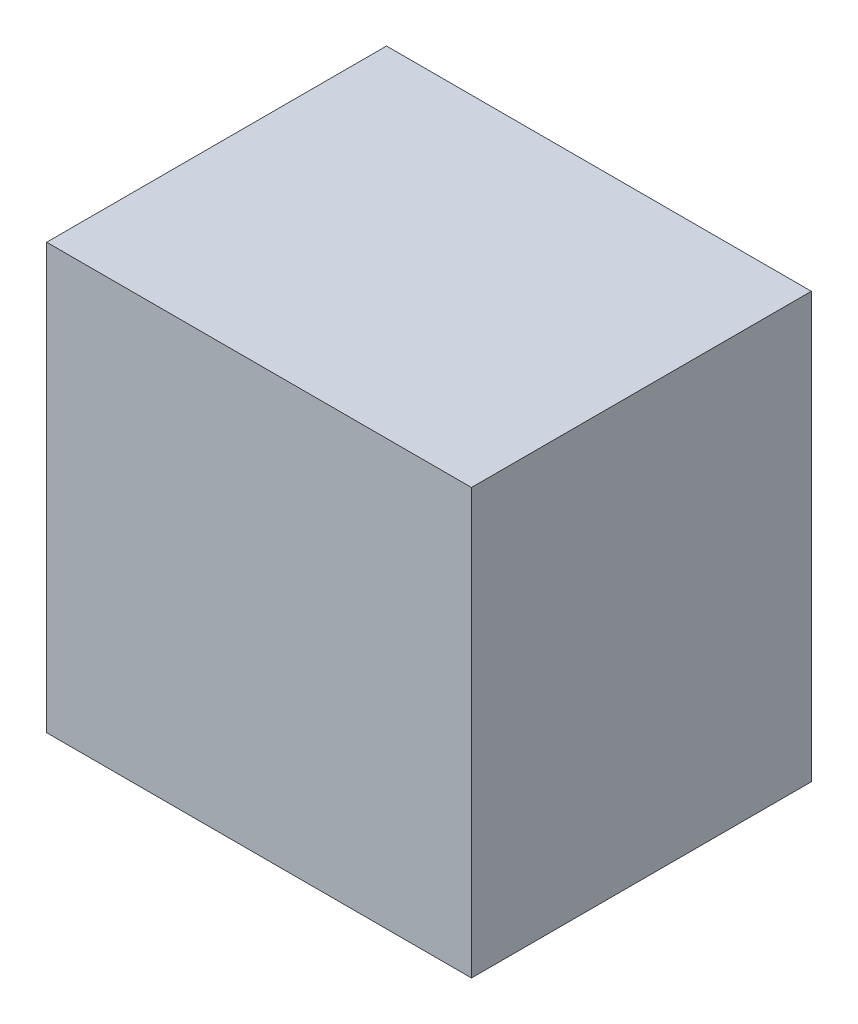
ISO-10303-21;
HEADER;
FILE_DESCRIPTION(('STEP AP214'),'2;1');
FILE_NAME('part.step','',(''),(''),'','','');
FILE_SCHEMA(('AUTOMOTIVE_DESIGN { 1 0 10303 214 1 1 1 1 }'));
ENDSEC;
DATA;
#1=APPLICATION_CONTEXT('core data for automotive mechanical design processes');
#2=APPLICATION_PROTOCOL_DEFINITION('international standard','automotive_design',2000,#1);
#3=PRODUCT_CONTEXT('',#1,'mechanical');
#4=PRODUCT('Part','Part','',(#3));
#5=PRODUCT_RELATED_PRODUCT_CATEGORY('part','',(#4));
#6=PRODUCT_DEFINITION_FORMATION('','',#4);
#7=PRODUCT_DEFINITION_CONTEXT('part definition',#1,'design');
#8=PRODUCT_DEFINITION('design','',#6,#7);
#9=PRODUCT_DEFINITION_SHAPE('','',#8);
#10=(LENGTH_UNIT() NAMED_UNIT(*) SI_UNIT(.MILLI.,.METRE.));
#11=(NAMED_UNIT(*) PLANE_ANGLE_UNIT() SI_UNIT($,.RADIAN.));
#12=(NAMED_UNIT(*) SI_UNIT($,.STERADIAN.) SOLID_ANGLE_UNIT());
#13=UNCERTAINTY_MEASURE_WITH_UNIT(LENGTH_MEASURE(1.E-05),#10,'distance_accuracy_value','');
#14=(GEOMETRIC_REPRESENTATION_CONTEXT(3) GLOBAL_UNCERTAINTY_ASSIGNED_CONTEXT((#13)) GLOBAL_UNIT_ASSIGNED_CONTEXT((#10,
#11,#12)) REPRESENTATION_CONTEXT('',''));
#15=CARTESIAN_POINT('',(0.,0.,0.));
#16=DIRECTION('',(0.,0.,1.));
#17=DIRECTION('',(1.,0.,0.));
#18=AXIS2_PLACEMENT_3D('',#15,#16,#17);
#19=CARTESIAN_POINT('',(12.5,-12.5,20.));
#20=DIRECTION('',(-1.,0.,0.));
#21=DIRECTION('',(0.,0.,1.));
#22=AXIS2_PLACEMENT_3D('',#19,#20,#21);
#23=PLANE('',#22);
#24=DIRECTION('',(0.,1.,0.));
#25=VECTOR('',#24,1.);
#26=CARTESIAN_POINT('',(12.5,-12.5,0.));
#27=LINE('',#26,#25);
#28=CARTESIAN_POINT('',(12.5,-12.5,0.));
#29=VERTEX_POINT('',#28);
#30=CARTESIAN_POINT('',(12.5,12.5,0.));
#31=VERTEX_POINT('',#30);
#32=EDGE_CURVE('E100',#29,#31,#27,.T.);
#33=ORIENTED_EDGE('',*,*,#32,.T.);
#34=DIRECTION('',(0.,0.,-1.));
#35=VECTOR('',#34,1.);
#36=CARTESIAN_POINT('',(12.5,12.5,20.));
#37=LINE('',#36,#35);
#38=CARTESIAN_POINT('',(12.5,12.5,20.));
#39=VERTEX_POINT('',#38);
#40=EDGE_CURVE('E11',#39,#31,#37,.T.);
#41=ORIENTED_EDGE('',*,*,#40,.F.);
#42=DIRECTION('',(0.,1.,0.));
#43=VECTOR('',#42,1.);
#44=CARTESIAN_POINT('',(12.5,-12.5,20.));
#45=LINE('',#44,#43);
#46=CARTESIAN_POINT('',(12.5,-12.5,20.));
#47=VERTEX_POINT('',#46);
#48=EDGE_CURVE('E88',#47,#39,#45,.T.);
#49=ORIENTED_EDGE('',*,*,#48,.F.);
#50=DIRECTION('',(0.,0.,-1.));
#51=VECTOR('',#50,1.);
#52=CARTESIAN_POINT('',(12.5,-12.5,20.));
#53=LINE('',#52,#51);
#54=EDGE_CURVE('E96',#47,#29,#53,.T.);
#55=ORIENTED_EDGE('',*,*,#54,.T.);
#56=EDGE_LOOP('',(#33,#41,#49,#55));
#57=FACE_BOUND('',#56,.T.);
#58=ADVANCED_FACE('F37',(#57),#23,.F.);
#59=CARTESIAN_POINT('',(-12.5,12.5,20.));
#60=DIRECTION('',(0.,-1.,0.));
#61=DIRECTION('',(0.,0.,-1.));
#62=AXIS2_PLACEMENT_3D('',#59,#60,#61);
#63=PLANE('',#62);
#64=DIRECTION('',(-1.,0.,0.));
#65=VECTOR('',#64,1.);
#66=CARTESIAN_POINT('',(-12.5,12.5,0.));
#67=LINE('',#66,#65);
#68=CARTESIAN_POINT('',(-12.5,12.5,0.));
#69=VERTEX_POINT('',#68);
#70=EDGE_CURVE('E92',#31,#69,#67,.T.);
#71=ORIENTED_EDGE('',*,*,#70,.T.);
#72=DIRECTION('',(0.,0.,-1.));
#73=VECTOR('',#72,1.);
#74=CARTESIAN_POINT('',(-12.5,12.5,20.));
#75=LINE('',#74,#73);
#76=CARTESIAN_POINT('',(-12.5,12.5,20.));
#77=VERTEX_POINT('',#76);
#78=EDGE_CURVE('E45',#77,#69,#75,.T.);
#79=ORIENTED_EDGE('',*,*,#78,.F.);
#80=DIRECTION('',(-1.,0.,0.));
#81=VECTOR('',#80,1.);
#82=CARTESIAN_POINT('',(-12.5,12.5,20.));
#83=LINE('',#82,#81);
#84=EDGE_CURVE('E83',#39,#77,#83,.T.);
#85=ORIENTED_EDGE('',*,*,#84,.F.);
#86=ORIENTED_EDGE('',*,*,#40,.T.);
#87=EDGE_LOOP('',(#71,#79,#85,#86));
#88=FACE_BOUND('',#87,.T.);
#89=ADVANCED_FACE('F91',(#88),#63,.F.);
#90=CARTESIAN_POINT('',(-12.5,-12.5,20.));
#91=DIRECTION('',(1.,0.,0.));
#92=DIRECTION('',(0.,0.,-1.));
#93=AXIS2_PLACEMENT_3D('',#90,#91,#92);
#94=PLANE('',#93);
#95=DIRECTION('',(0.,-1.,0.));
#96=VECTOR('',#95,1.);
#97=CARTESIAN_POINT('',(-12.5,-12.5,0.));
#98=LINE('',#97,#96);
#99=CARTESIAN_POINT('',(-12.5,-12.5,0.));
#100=VERTEX_POINT('',#99);
#101=EDGE_CURVE('E70',#69,#100,#98,.T.);
#102=ORIENTED_EDGE('',*,*,#101,.T.);
#103=DIRECTION('',(0.,0.,-1.));
#104=VECTOR('',#103,1.);
#105=CARTESIAN_POINT('',(-12.5,-12.5,20.));
#106=LINE('',#105,#104);
#107=CARTESIAN_POINT('',(-12.5,-12.5,20.));
#108=VERTEX_POINT('',#107);
#109=EDGE_CURVE('E93',#108,#100,#106,.T.);
#110=ORIENTED_EDGE('',*,*,#109,.F.);
#111=DIRECTION('',(0.,-1.,0.));
#112=VECTOR('',#111,1.);
#113=CARTESIAN_POINT('',(-12.5,-12.5,20.));
#114=LINE('',#113,#112);
#115=EDGE_CURVE('E86',#77,#108,#114,.T.);
#116=ORIENTED_EDGE('',*,*,#115,.F.);
#117=ORIENTED_EDGE('',*,*,#78,.T.);
#118=EDGE_LOOP('',(#102,#110,#116,#117));
#119=FACE_BOUND('',#118,.T.);
#120=ADVANCED_FACE('F94',(#119),#94,.F.);
#121=CARTESIAN_POINT('',(-12.5,-12.5,20.));
#122=DIRECTION('',(0.,1.,0.));
#123=DIRECTION('',(0.,0.,1.));
#124=AXIS2_PLACEMENT_3D('',#121,#122,#123);
#125=PLANE('',#124);
#126=DIRECTION('',(1.,0.,0.));
#127=VECTOR('',#126,1.);
#128=CARTESIAN_POINT('',(-12.5,-12.5,0.));
#129=LINE('',#128,#127);
#130=EDGE_CURVE('E76',#100,#29,#129,.T.);
#131=ORIENTED_EDGE('',*,*,#130,.T.);
#132=ORIENTED_EDGE('',*,*,#54,.F.);
#133=DIRECTION('',(1.,0.,0.));
#134=VECTOR('',#133,1.);
#135=CARTESIAN_POINT('',(-12.5,-12.5,20.));
#136=LINE('',#135,#134);
#137=EDGE_CURVE('E53',#108,#47,#136,.T.);
#138=ORIENTED_EDGE('',*,*,#137,.F.);
#139=ORIENTED_EDGE('',*,*,#109,.T.);
#140=EDGE_LOOP('',(#131,#132,#138,#139));
#141=FACE_BOUND('',#140,.T.);
#142=ADVANCED_FACE('F107',(#141),#125,.F.);
#143=CARTESIAN_POINT('',(0.,0.,20.));
#144=DIRECTION('',(0.,0.,-1.));
#145=DIRECTION('',(-1.,0.,0.));
#146=AXIS2_PLACEMENT_3D('',#143,#144,#145);
#147=PLANE('',#146);
#148=ORIENTED_EDGE('',*,*,#48,.T.);
#149=ORIENTED_EDGE('',*,*,#84,.T.);
#150=ORIENTED_EDGE('',*,*,#115,.T.);
#151=ORIENTED_EDGE('',*,*,#137,.T.);
#152=EDGE_LOOP('',(#148,#149,#150,#151));
#153=FACE_BOUND('',#152,.T.);
#154=ADVANCED_FACE('F84',(#153),#147,.F.);
#155=CARTESIAN_POINT('',(0.,0.,0.));
#156=DIRECTION('',(0.,0.,-1.));
#157=DIRECTION('',(-1.,0.,0.));
#158=AXIS2_PLACEMENT_3D('',#155,#156,#157);
#159=PLANE('',#158);
#160=ORIENTED_EDGE('',*,*,#32,.F.);
#161=ORIENTED_EDGE('',*,*,#130,.F.);
#162=ORIENTED_EDGE('',*,*,#101,.F.);
#163=ORIENTED_EDGE('',*,*,#70,.F.);
#164=EDGE_LOOP('',(#160,#161,#162,#163));
#165=FACE_BOUND('',#164,.T.);
#166=ADVANCED_FACE('F110',(#165),#159,.T.);
#167=CLOSED_SHELL('',(#58,#89,#120,#142,#154,#166));
#168=MANIFOLD_SOLID_BREP('B2',#167);
#169=ADVANCED_BREP_SHAPE_REPRESENTATION('',(#18,#168),#14);
#170=SHAPE_DEFINITION_REPRESENTATION(#9,#169);
ENDSEC;
END-ISO-10303-21;
